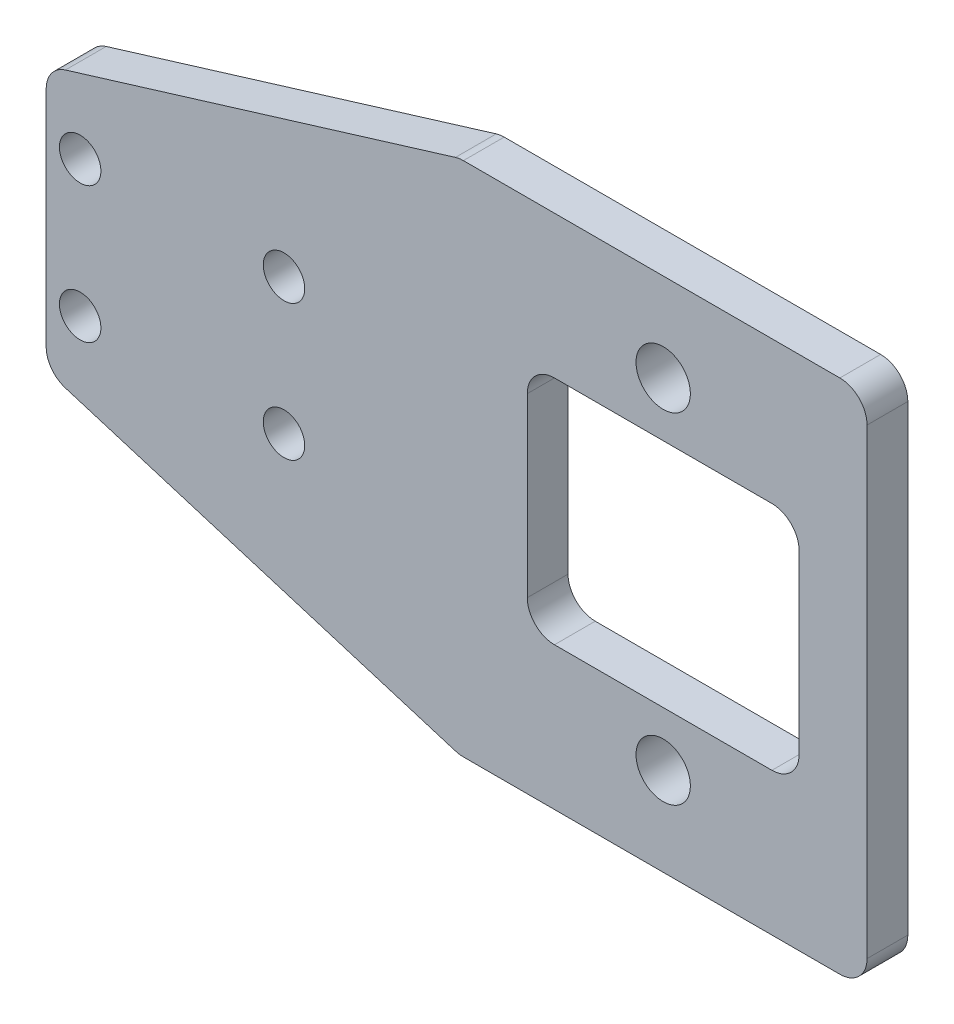
ISO-10303-21;
HEADER;
FILE_DESCRIPTION(('STEP AP214'),'2;1');
FILE_NAME('part.step','',(''),(''),'','','');
FILE_SCHEMA(('AUTOMOTIVE_DESIGN { 1 0 10303 214 1 1 1 1 }'));
ENDSEC;
DATA;
#1=APPLICATION_CONTEXT('core data for automotive mechanical design processes');
#2=APPLICATION_PROTOCOL_DEFINITION('international standard','automotive_design',2000,#1);
#3=PRODUCT_CONTEXT('',#1,'mechanical');
#4=PRODUCT('Part','Part','',(#3));
#5=PRODUCT_RELATED_PRODUCT_CATEGORY('part','',(#4));
#6=PRODUCT_DEFINITION_FORMATION('','',#4);
#7=PRODUCT_DEFINITION_CONTEXT('part definition',#1,'design');
#8=PRODUCT_DEFINITION('design','',#6,#7);
#9=PRODUCT_DEFINITION_SHAPE('','',#8);
#10=(LENGTH_UNIT() NAMED_UNIT(*) SI_UNIT(.MILLI.,.METRE.));
#11=(NAMED_UNIT(*) PLANE_ANGLE_UNIT() SI_UNIT($,.RADIAN.));
#12=(NAMED_UNIT(*) SI_UNIT($,.STERADIAN.) SOLID_ANGLE_UNIT());
#13=UNCERTAINTY_MEASURE_WITH_UNIT(LENGTH_MEASURE(1.E-05),#10,'distance_accuracy_value','');
#14=(GEOMETRIC_REPRESENTATION_CONTEXT(3) GLOBAL_UNCERTAINTY_ASSIGNED_CONTEXT((#13)) GLOBAL_UNIT_ASSIGNED_CONTEXT((#10,
#11,#12)) REPRESENTATION_CONTEXT('',''));
#15=CARTESIAN_POINT('',(0.,0.,0.));
#16=DIRECTION('',(0.,0.,1.));
#17=DIRECTION('',(1.,0.,0.));
#18=AXIS2_PLACEMENT_3D('',#15,#16,#17);
#19=CARTESIAN_POINT('',(-45.4,0.,3.));
#20=DIRECTION('',(1.,0.,0.));
#21=DIRECTION('',(0.,0.,-1.));
#22=AXIS2_PLACEMENT_3D('',#19,#20,#21);
#23=PLANE('',#22);
#24=DIRECTION('',(0.,-1.,0.));
#25=VECTOR('',#24,1.);
#26=CARTESIAN_POINT('',(-45.4,0.,3.));
#27=LINE('',#26,#25);
#28=CARTESIAN_POINT('',(-45.4,8.2203472423068,3.));
#29=VERTEX_POINT('',#28);
#30=CARTESIAN_POINT('',(-45.4,-8.2203472423068,3.));
#31=VERTEX_POINT('',#30);
#32=EDGE_CURVE('E194',#29,#31,#27,.T.);
#33=ORIENTED_EDGE('',*,*,#32,.F.);
#34=DIRECTION('',(0.,0.,-1.));
#35=VECTOR('',#34,1.);
#36=CARTESIAN_POINT('',(-45.4,8.2203472423068,3.));
#37=LINE('',#36,#35);
#38=CARTESIAN_POINT('',(-45.4,8.2203472423068,0.));
#39=VERTEX_POINT('',#38);
#40=EDGE_CURVE('E179',#29,#39,#37,.T.);
#41=ORIENTED_EDGE('',*,*,#40,.T.);
#42=DIRECTION('',(0.,-1.,0.));
#43=VECTOR('',#42,1.);
#44=CARTESIAN_POINT('',(-45.4,0.,0.));
#45=LINE('',#44,#43);
#46=CARTESIAN_POINT('',(-45.4,-8.2203472423068,0.));
#47=VERTEX_POINT('',#46);
#48=EDGE_CURVE('E191',#39,#47,#45,.T.);
#49=ORIENTED_EDGE('',*,*,#48,.T.);
#50=DIRECTION('',(0.,0.,-1.));
#51=VECTOR('',#50,1.);
#52=CARTESIAN_POINT('',(-45.4,-8.2203472423068,3.));
#53=LINE('',#52,#51);
#54=EDGE_CURVE('E196',#47,#31,#53,.F.);
#55=ORIENTED_EDGE('',*,*,#54,.T.);
#56=EDGE_LOOP('',(#33,#41,#49,#55));
#57=FACE_BOUND('',#56,.T.);
#58=ADVANCED_FACE('F37',(#57),#23,.F.);
#59=CARTESIAN_POINT('',(-6.59875327759363,-21.5701182407362,3.));
#60=DIRECTION('',(0.292538182187218,0.956253842848539,0.));
#61=DIRECTION('',(-0.956253842848539,0.292538182187218,0.));
#62=AXIS2_PLACEMENT_3D('',#59,#60,#61);
#63=PLANE('',#62);
#64=DIRECTION('',(0.956253842848539,-0.292538182187218,0.));
#65=VECTOR('',#64,1.);
#66=CARTESIAN_POINT('',(-6.59875327759363,-21.5701182407362,3.));
#67=LINE('',#66,#65);
#68=CARTESIAN_POINT('',(-43.9850763643744,-10.1328549280039,3.));
#69=VERTEX_POINT('',#68);
#70=CARTESIAN_POINT('',(-15.2859963822375,-18.9125076856971,3.));
#71=VERTEX_POINT('',#70);
#72=EDGE_CURVE('E367',#69,#71,#67,.T.);
#73=ORIENTED_EDGE('',*,*,#72,.F.);
#74=DIRECTION('',(0.,0.,-1.));
#75=VECTOR('',#74,1.);
#76=CARTESIAN_POINT('',(-43.9850763643744,-10.1328549280039,3.));
#77=LINE('',#76,#75);
#78=CARTESIAN_POINT('',(-43.9850763643744,-10.1328549280039,0.));
#79=VERTEX_POINT('',#78);
#80=EDGE_CURVE('E254',#69,#79,#77,.T.);
#81=ORIENTED_EDGE('',*,*,#80,.T.);
#82=DIRECTION('',(0.956253842848539,-0.292538182187218,0.));
#83=VECTOR('',#82,1.);
#84=CARTESIAN_POINT('',(-6.59875327759363,-21.5701182407362,0.));
#85=LINE('',#84,#83);
#86=CARTESIAN_POINT('',(-15.2859963822375,-18.9125076856971,0.));
#87=VERTEX_POINT('',#86);
#88=EDGE_CURVE('E201',#79,#87,#85,.T.);
#89=ORIENTED_EDGE('',*,*,#88,.T.);
#90=DIRECTION('',(0.,0.,-1.));
#91=VECTOR('',#90,1.);
#92=CARTESIAN_POINT('',(-15.2859963822375,-18.9125076856971,3.));
#93=LINE('',#92,#91);
#94=EDGE_CURVE('E252',#87,#71,#93,.F.);
#95=ORIENTED_EDGE('',*,*,#94,.T.);
#96=EDGE_LOOP('',(#73,#81,#89,#95));
#97=FACE_BOUND('',#96,.T.);
#98=ADVANCED_FACE('F416',(#97),#63,.F.);
#99=CARTESIAN_POINT('',(0.,-19.,3.));
#100=DIRECTION('',(0.,1.,0.));
#101=DIRECTION('',(0.,0.,1.));
#102=AXIS2_PLACEMENT_3D('',#99,#100,#101);
#103=PLANE('',#102);
#104=DIRECTION('',(1.,0.,0.));
#105=VECTOR('',#104,1.);
#106=CARTESIAN_POINT('',(0.,-19.,3.));
#107=LINE('',#106,#105);
#108=CARTESIAN_POINT('',(-14.7009200178631,-19.,3.));
#109=VERTEX_POINT('',#108);
#110=CARTESIAN_POINT('',(13.,-19.,3.));
#111=VERTEX_POINT('',#110);
#112=EDGE_CURVE('E370',#109,#111,#107,.T.);
#113=ORIENTED_EDGE('',*,*,#112,.F.);
#114=DIRECTION('',(0.,0.,-1.));
#115=VECTOR('',#114,1.);
#116=CARTESIAN_POINT('',(-14.7009200178631,-19.,3.));
#117=LINE('',#116,#115);
#118=CARTESIAN_POINT('',(-14.7009200178631,-19.,0.));
#119=VERTEX_POINT('',#118);
#120=EDGE_CURVE('E259',#109,#119,#117,.T.);
#121=ORIENTED_EDGE('',*,*,#120,.T.);
#122=DIRECTION('',(1.,0.,0.));
#123=VECTOR('',#122,1.);
#124=CARTESIAN_POINT('',(0.,-19.,0.));
#125=LINE('',#124,#123);
#126=CARTESIAN_POINT('',(13.,-19.,0.));
#127=VERTEX_POINT('',#126);
#128=EDGE_CURVE('E205',#119,#127,#125,.T.);
#129=ORIENTED_EDGE('',*,*,#128,.T.);
#130=DIRECTION('',(0.,0.,-1.));
#131=VECTOR('',#130,1.);
#132=CARTESIAN_POINT('',(13.,-19.,3.));
#133=LINE('',#132,#131);
#134=EDGE_CURVE('E257',#127,#111,#133,.F.);
#135=ORIENTED_EDGE('',*,*,#134,.T.);
#136=EDGE_LOOP('',(#113,#121,#129,#135));
#137=FACE_BOUND('',#136,.T.);
#138=ADVANCED_FACE('F408',(#137),#103,.F.);
#139=CARTESIAN_POINT('',(15.,0.,3.));
#140=DIRECTION('',(-1.,0.,0.));
#141=DIRECTION('',(0.,0.,1.));
#142=AXIS2_PLACEMENT_3D('',#139,#140,#141);
#143=PLANE('',#142);
#144=DIRECTION('',(0.,1.,0.));
#145=VECTOR('',#144,1.);
#146=CARTESIAN_POINT('',(15.,0.,3.));
#147=LINE('',#146,#145);
#148=CARTESIAN_POINT('',(15.,-17.,3.));
#149=VERTEX_POINT('',#148);
#150=CARTESIAN_POINT('',(15.,17.,3.));
#151=VERTEX_POINT('',#150);
#152=EDGE_CURVE('E373',#149,#151,#147,.T.);
#153=ORIENTED_EDGE('',*,*,#152,.F.);
#154=DIRECTION('',(0.,0.,-1.));
#155=VECTOR('',#154,1.);
#156=CARTESIAN_POINT('',(15.,-17.,3.));
#157=LINE('',#156,#155);
#158=CARTESIAN_POINT('',(15.,-17.,0.));
#159=VERTEX_POINT('',#158);
#160=EDGE_CURVE('E264',#149,#159,#157,.T.);
#161=ORIENTED_EDGE('',*,*,#160,.T.);
#162=DIRECTION('',(0.,1.,0.));
#163=VECTOR('',#162,1.);
#164=CARTESIAN_POINT('',(15.,0.,0.));
#165=LINE('',#164,#163);
#166=CARTESIAN_POINT('',(15.,17.,0.));
#167=VERTEX_POINT('',#166);
#168=EDGE_CURVE('E216',#159,#167,#165,.T.);
#169=ORIENTED_EDGE('',*,*,#168,.T.);
#170=DIRECTION('',(0.,0.,-1.));
#171=VECTOR('',#170,1.);
#172=CARTESIAN_POINT('',(15.,17.,3.));
#173=LINE('',#172,#171);
#174=EDGE_CURVE('E262',#167,#151,#173,.F.);
#175=ORIENTED_EDGE('',*,*,#174,.T.);
#176=EDGE_LOOP('',(#153,#161,#169,#175));
#177=FACE_BOUND('',#176,.T.);
#178=ADVANCED_FACE('F399',(#177),#143,.F.);
#179=CARTESIAN_POINT('',(0.,19.,3.));
#180=DIRECTION('',(0.,1.,0.));
#181=DIRECTION('',(0.,0.,1.));
#182=AXIS2_PLACEMENT_3D('',#179,#180,#181);
#183=PLANE('',#182);
#184=DIRECTION('',(1.,0.,0.));
#185=VECTOR('',#184,1.);
#186=CARTESIAN_POINT('',(0.,19.,0.));
#187=LINE('',#186,#185);
#188=CARTESIAN_POINT('',(-14.7009200178631,19.,0.));
#189=VERTEX_POINT('',#188);
#190=CARTESIAN_POINT('',(13.,19.,0.));
#191=VERTEX_POINT('',#190);
#192=EDGE_CURVE('E219',#189,#191,#187,.T.);
#193=ORIENTED_EDGE('',*,*,#192,.F.);
#194=DIRECTION('',(0.,0.,-1.));
#195=VECTOR('',#194,1.);
#196=CARTESIAN_POINT('',(-14.7009200178631,19.,3.));
#197=LINE('',#196,#195);
#198=CARTESIAN_POINT('',(-14.7009200178631,19.,3.));
#199=VERTEX_POINT('',#198);
#200=EDGE_CURVE('E250',#189,#199,#197,.F.);
#201=ORIENTED_EDGE('',*,*,#200,.T.);
#202=DIRECTION('',(1.,0.,0.));
#203=VECTOR('',#202,1.);
#204=CARTESIAN_POINT('',(0.,19.,3.));
#205=LINE('',#204,#203);
#206=CARTESIAN_POINT('',(13.,19.,3.));
#207=VERTEX_POINT('',#206);
#208=EDGE_CURVE('E375',#199,#207,#205,.T.);
#209=ORIENTED_EDGE('',*,*,#208,.T.);
#210=DIRECTION('',(0.,0.,-1.));
#211=VECTOR('',#210,1.);
#212=CARTESIAN_POINT('',(13.,19.,0.));
#213=LINE('',#212,#211);
#214=EDGE_CURVE('E247',#207,#191,#213,.T.);
#215=ORIENTED_EDGE('',*,*,#214,.T.);
#216=EDGE_LOOP('',(#193,#201,#209,#215));
#217=FACE_BOUND('',#216,.T.);
#218=ADVANCED_FACE('F391',(#217),#183,.T.);
#219=CARTESIAN_POINT('',(-6.59875327759363,21.5701182407362,3.));
#220=DIRECTION('',(0.292538182187218,-0.956253842848539,0.));
#221=DIRECTION('',(0.956253842848539,0.292538182187218,0.));
#222=AXIS2_PLACEMENT_3D('',#219,#220,#221);
#223=PLANE('',#222);
#224=DIRECTION('',(-0.956253842848539,-0.292538182187218,0.));
#225=VECTOR('',#224,1.);
#226=CARTESIAN_POINT('',(-6.59875327759363,21.5701182407362,0.));
#227=LINE('',#226,#225);
#228=CARTESIAN_POINT('',(-15.2859963822375,18.9125076856971,0.));
#229=VERTEX_POINT('',#228);
#230=CARTESIAN_POINT('',(-43.9850763643744,10.1328549280039,0.));
#231=VERTEX_POINT('',#230);
#232=EDGE_CURVE('E222',#229,#231,#227,.T.);
#233=ORIENTED_EDGE('',*,*,#232,.T.);
#234=DIRECTION('',(0.,0.,-1.));
#235=VECTOR('',#234,1.);
#236=CARTESIAN_POINT('',(-43.9850763643744,10.1328549280039,3.));
#237=LINE('',#236,#235);
#238=CARTESIAN_POINT('',(-43.9850763643744,10.1328549280039,3.));
#239=VERTEX_POINT('',#238);
#240=EDGE_CURVE('E180',#231,#239,#237,.F.);
#241=ORIENTED_EDGE('',*,*,#240,.T.);
#242=DIRECTION('',(-0.956253842848539,-0.292538182187218,0.));
#243=VECTOR('',#242,1.);
#244=CARTESIAN_POINT('',(-6.59875327759363,21.5701182407362,3.));
#245=LINE('',#244,#243);
#246=CARTESIAN_POINT('',(-15.2859963822375,18.9125076856971,3.));
#247=VERTEX_POINT('',#246);
#248=EDGE_CURVE('E211',#247,#239,#245,.T.);
#249=ORIENTED_EDGE('',*,*,#248,.F.);
#250=DIRECTION('',(0.,0.,-1.));
#251=VECTOR('',#250,1.);
#252=CARTESIAN_POINT('',(-15.2859963822375,18.9125076856971,0.));
#253=LINE('',#252,#251);
#254=EDGE_CURVE('E185',#247,#229,#253,.T.);
#255=ORIENTED_EDGE('',*,*,#254,.T.);
#256=EDGE_LOOP('',(#233,#241,#249,#255));
#257=FACE_BOUND('',#256,.T.);
#258=ADVANCED_FACE('F386',(#257),#223,.F.);
#259=CARTESIAN_POINT('',(0.,0.,3.));
#260=DIRECTION('',(0.,0.,1.));
#261=DIRECTION('',(1.,0.,0.));
#262=AXIS2_PLACEMENT_3D('',#259,#260,#261);
#263=PLANE('',#262);
#264=DIRECTION('',(0.,1.,0.));
#265=VECTOR('',#264,1.);
#266=CARTESIAN_POINT('',(10.,-8.50000000000001,3.));
#267=LINE('',#266,#265);
#268=CARTESIAN_POINT('',(10.,-6.50000000000001,3.));
#269=VERTEX_POINT('',#268);
#270=CARTESIAN_POINT('',(10.,6.50000000000001,3.));
#271=VERTEX_POINT('',#270);
#272=EDGE_CURVE('E303',#269,#271,#267,.T.);
#273=ORIENTED_EDGE('',*,*,#272,.F.);
#274=CARTESIAN_POINT('',(8.,-6.50000000000001,3.));
#275=DIRECTION('',(0.,0.,1.));
#276=DIRECTION('',(1.,0.,0.));
#277=AXIS2_PLACEMENT_3D('',#274,#275,#276);
#278=CIRCLE('',#277,2.);
#279=CARTESIAN_POINT('',(8.,-8.50000000000001,3.));
#280=VERTEX_POINT('',#279);
#281=EDGE_CURVE('E45',#269,#280,#278,.F.);
#282=ORIENTED_EDGE('',*,*,#281,.T.);
#283=DIRECTION('',(1.,0.,0.));
#284=VECTOR('',#283,1.);
#285=CARTESIAN_POINT('',(-9.99999999999999,-8.50000000000001,3.));
#286=LINE('',#285,#284);
#287=CARTESIAN_POINT('',(-7.99999999999999,-8.50000000000001,3.));
#288=VERTEX_POINT('',#287);
#289=EDGE_CURVE('E301',#288,#280,#286,.T.);
#290=ORIENTED_EDGE('',*,*,#289,.F.);
#291=CARTESIAN_POINT('',(-7.99999999999999,-6.50000000000001,3.));
#292=DIRECTION('',(0.,0.,1.));
#293=DIRECTION('',(1.,0.,0.));
#294=AXIS2_PLACEMENT_3D('',#291,#292,#293);
#295=CIRCLE('',#294,2.);
#296=CARTESIAN_POINT('',(-9.99999999999999,-6.50000000000001,3.));
#297=VERTEX_POINT('',#296);
#298=EDGE_CURVE('E294',#288,#297,#295,.F.);
#299=ORIENTED_EDGE('',*,*,#298,.T.);
#300=DIRECTION('',(0.,-1.,0.));
#301=VECTOR('',#300,1.);
#302=CARTESIAN_POINT('',(-9.99999999999999,-8.50000000000001,3.));
#303=LINE('',#302,#301);
#304=CARTESIAN_POINT('',(-10.,6.50000000000001,3.));
#305=VERTEX_POINT('',#304);
#306=EDGE_CURVE('E309',#305,#297,#303,.T.);
#307=ORIENTED_EDGE('',*,*,#306,.F.);
#308=CARTESIAN_POINT('',(-8.,6.50000000000001,3.));
#309=DIRECTION('',(0.,0.,1.));
#310=DIRECTION('',(1.,0.,0.));
#311=AXIS2_PLACEMENT_3D('',#308,#309,#310);
#312=CIRCLE('',#311,2.);
#313=CARTESIAN_POINT('',(-8.,8.50000000000001,3.));
#314=VERTEX_POINT('',#313);
#315=EDGE_CURVE('E286',#305,#314,#312,.F.);
#316=ORIENTED_EDGE('',*,*,#315,.T.);
#317=DIRECTION('',(-1.,0.,0.));
#318=VECTOR('',#317,1.);
#319=CARTESIAN_POINT('',(-10.,8.50000000000001,3.));
#320=LINE('',#319,#318);
#321=CARTESIAN_POINT('',(8.,8.50000000000001,3.));
#322=VERTEX_POINT('',#321);
#323=EDGE_CURVE('E330',#322,#314,#320,.T.);
#324=ORIENTED_EDGE('',*,*,#323,.F.);
#325=CARTESIAN_POINT('',(8.,6.50000000000001,3.));
#326=DIRECTION('',(0.,0.,1.));
#327=DIRECTION('',(1.,0.,0.));
#328=AXIS2_PLACEMENT_3D('',#325,#326,#327);
#329=CIRCLE('',#328,2.);
#330=EDGE_CURVE('E290',#322,#271,#329,.F.);
#331=ORIENTED_EDGE('',*,*,#330,.T.);
#332=EDGE_LOOP('',(#273,#282,#290,#299,#307,#316,#324,#331));
#333=FACE_BOUND('',#332,.T.);
#334=CARTESIAN_POINT('',(-27.9,5.,3.));
#335=DIRECTION('',(0.,0.,1.));
#336=DIRECTION('',(1.,0.,0.));
#337=AXIS2_PLACEMENT_3D('',#334,#335,#336);
#338=CIRCLE('',#337,1.525);
#339=CARTESIAN_POINT('',(-26.375,5.,3.));
#340=VERTEX_POINT('',#339);
#341=EDGE_CURVE('E345',#340,#340,#338,.T.);
#342=ORIENTED_EDGE('',*,*,#341,.F.);
#343=EDGE_LOOP('',(#342));
#344=FACE_BOUND('',#343,.T.);
#345=CARTESIAN_POINT('',(-42.9,-5.,3.));
#346=DIRECTION('',(0.,0.,1.));
#347=DIRECTION('',(1.,0.,0.));
#348=AXIS2_PLACEMENT_3D('',#345,#346,#347);
#349=CIRCLE('',#348,1.525);
#350=CARTESIAN_POINT('',(-41.375,-5.,3.));
#351=VERTEX_POINT('',#350);
#352=EDGE_CURVE('E338',#351,#351,#349,.T.);
#353=ORIENTED_EDGE('',*,*,#352,.F.);
#354=EDGE_LOOP('',(#353));
#355=FACE_BOUND('',#354,.T.);
#356=CARTESIAN_POINT('',(-27.9,-5.,3.));
#357=DIRECTION('',(0.,0.,1.));
#358=DIRECTION('',(1.,0.,0.));
#359=AXIS2_PLACEMENT_3D('',#356,#357,#358);
#360=CIRCLE('',#359,1.525);
#361=CARTESIAN_POINT('',(-26.375,-5.,3.));
#362=VERTEX_POINT('',#361);
#363=EDGE_CURVE('E328',#362,#362,#360,.T.);
#364=ORIENTED_EDGE('',*,*,#363,.F.);
#365=EDGE_LOOP('',(#364));
#366=FACE_BOUND('',#365,.T.);
#367=CARTESIAN_POINT('',(-42.9,5.,3.));
#368=DIRECTION('',(0.,0.,1.));
#369=DIRECTION('',(1.,0.,0.));
#370=AXIS2_PLACEMENT_3D('',#367,#368,#369);
#371=CIRCLE('',#370,1.525);
#372=CARTESIAN_POINT('',(-41.375,5.,3.));
#373=VERTEX_POINT('',#372);
#374=EDGE_CURVE('E344',#373,#373,#371,.T.);
#375=ORIENTED_EDGE('',*,*,#374,.F.);
#376=EDGE_LOOP('',(#375));
#377=FACE_BOUND('',#376,.T.);
#378=CARTESIAN_POINT('',(0.,12.5,3.));
#379=DIRECTION('',(0.,0.,1.));
#380=DIRECTION('',(1.,0.,0.));
#381=AXIS2_PLACEMENT_3D('',#378,#379,#380);
#382=CIRCLE('',#381,2.);
#383=CARTESIAN_POINT('',(1.99999999999999,12.5,3.));
#384=VERTEX_POINT('',#383);
#385=EDGE_CURVE('E208',#384,#384,#382,.T.);
#386=ORIENTED_EDGE('',*,*,#385,.F.);
#387=EDGE_LOOP('',(#386));
#388=FACE_BOUND('',#387,.T.);
#389=CARTESIAN_POINT('',(0.,-12.5,3.));
#390=DIRECTION('',(0.,0.,1.));
#391=DIRECTION('',(1.,0.,0.));
#392=AXIS2_PLACEMENT_3D('',#389,#390,#391);
#393=CIRCLE('',#392,2.);
#394=CARTESIAN_POINT('',(1.99999999999999,-12.5,3.));
#395=VERTEX_POINT('',#394);
#396=EDGE_CURVE('E356',#395,#395,#393,.T.);
#397=ORIENTED_EDGE('',*,*,#396,.F.);
#398=EDGE_LOOP('',(#397));
#399=FACE_BOUND('',#398,.T.);
#400=ORIENTED_EDGE('',*,*,#248,.T.);
#401=CARTESIAN_POINT('',(-43.4,8.2203472423068,3.));
#402=DIRECTION('',(0.,0.,1.));
#403=DIRECTION('',(1.,0.,0.));
#404=AXIS2_PLACEMENT_3D('',#401,#402,#403);
#405=CIRCLE('',#404,2.);
#406=EDGE_CURVE('E245',#239,#29,#405,.T.);
#407=ORIENTED_EDGE('',*,*,#406,.T.);
#408=ORIENTED_EDGE('',*,*,#32,.T.);
#409=CARTESIAN_POINT('',(-43.4,-8.2203472423068,3.));
#410=DIRECTION('',(0.,0.,1.));
#411=DIRECTION('',(1.,0.,0.));
#412=AXIS2_PLACEMENT_3D('',#409,#410,#411);
#413=CIRCLE('',#412,2.);
#414=EDGE_CURVE('E241',#31,#69,#413,.T.);
#415=ORIENTED_EDGE('',*,*,#414,.T.);
#416=ORIENTED_EDGE('',*,*,#72,.T.);
#417=CARTESIAN_POINT('',(-14.7009200178631,-17.,3.));
#418=DIRECTION('',(0.,0.,1.));
#419=DIRECTION('',(1.,0.,0.));
#420=AXIS2_PLACEMENT_3D('',#417,#418,#419);
#421=CIRCLE('',#420,2.);
#422=EDGE_CURVE('E239',#71,#109,#421,.T.);
#423=ORIENTED_EDGE('',*,*,#422,.T.);
#424=ORIENTED_EDGE('',*,*,#112,.T.);
#425=CARTESIAN_POINT('',(13.,-17.,3.));
#426=DIRECTION('',(0.,0.,1.));
#427=DIRECTION('',(1.,0.,0.));
#428=AXIS2_PLACEMENT_3D('',#425,#426,#427);
#429=CIRCLE('',#428,2.);
#430=EDGE_CURVE('E237',#111,#149,#429,.T.);
#431=ORIENTED_EDGE('',*,*,#430,.T.);
#432=ORIENTED_EDGE('',*,*,#152,.T.);
#433=CARTESIAN_POINT('',(13.,17.,3.));
#434=DIRECTION('',(0.,0.,1.));
#435=DIRECTION('',(1.,0.,0.));
#436=AXIS2_PLACEMENT_3D('',#433,#434,#435);
#437=CIRCLE('',#436,2.);
#438=EDGE_CURVE('E235',#151,#207,#437,.T.);
#439=ORIENTED_EDGE('',*,*,#438,.T.);
#440=ORIENTED_EDGE('',*,*,#208,.F.);
#441=CARTESIAN_POINT('',(-14.7009200178631,17.,3.));
#442=DIRECTION('',(0.,0.,1.));
#443=DIRECTION('',(1.,0.,0.));
#444=AXIS2_PLACEMENT_3D('',#441,#442,#443);
#445=CIRCLE('',#444,2.);
#446=EDGE_CURVE('E243',#199,#247,#445,.T.);
#447=ORIENTED_EDGE('',*,*,#446,.T.);
#448=EDGE_LOOP('',(#400,#407,#408,#415,#416,#423,#424,#431,#432,#439,#440,#447));
#449=FACE_BOUND('',#448,.T.);
#450=ADVANCED_FACE('F299',(#333,#344,#355,#366,#377,#388,#399,#449),#263,.T.);
#451=CARTESIAN_POINT('',(0.,0.,0.));
#452=DIRECTION('',(0.,0.,1.));
#453=DIRECTION('',(1.,0.,0.));
#454=AXIS2_PLACEMENT_3D('',#451,#452,#453);
#455=PLANE('',#454);
#456=DIRECTION('',(0.,-1.,0.));
#457=VECTOR('',#456,1.);
#458=CARTESIAN_POINT('',(-9.99999999999999,-8.50000000000001,0.));
#459=LINE('',#458,#457);
#460=CARTESIAN_POINT('',(-10.,6.50000000000001,0.));
#461=VERTEX_POINT('',#460);
#462=CARTESIAN_POINT('',(-9.99999999999999,-6.50000000000001,0.));
#463=VERTEX_POINT('',#462);
#464=EDGE_CURVE('E323',#461,#463,#459,.T.);
#465=ORIENTED_EDGE('',*,*,#464,.T.);
#466=CARTESIAN_POINT('',(-7.99999999999999,-6.50000000000001,0.));
#467=DIRECTION('',(0.,0.,1.));
#468=DIRECTION('',(1.,0.,0.));
#469=AXIS2_PLACEMENT_3D('',#466,#467,#468);
#470=CIRCLE('',#469,2.);
#471=CARTESIAN_POINT('',(-7.99999999999999,-8.50000000000001,0.));
#472=VERTEX_POINT('',#471);
#473=EDGE_CURVE('E59',#463,#472,#470,.T.);
#474=ORIENTED_EDGE('',*,*,#473,.T.);
#475=DIRECTION('',(1.,0.,0.));
#476=VECTOR('',#475,1.);
#477=CARTESIAN_POINT('',(-9.99999999999999,-8.50000000000001,0.));
#478=LINE('',#477,#476);
#479=CARTESIAN_POINT('',(8.,-8.50000000000001,0.));
#480=VERTEX_POINT('',#479);
#481=EDGE_CURVE('E316',#472,#480,#478,.T.);
#482=ORIENTED_EDGE('',*,*,#481,.T.);
#483=CARTESIAN_POINT('',(8.,-6.50000000000001,0.));
#484=DIRECTION('',(0.,0.,1.));
#485=DIRECTION('',(1.,0.,0.));
#486=AXIS2_PLACEMENT_3D('',#483,#484,#485);
#487=CIRCLE('',#486,2.);
#488=CARTESIAN_POINT('',(10.,-6.50000000000001,0.));
#489=VERTEX_POINT('',#488);
#490=EDGE_CURVE('E11',#480,#489,#487,.T.);
#491=ORIENTED_EDGE('',*,*,#490,.T.);
#492=DIRECTION('',(0.,1.,0.));
#493=VECTOR('',#492,1.);
#494=CARTESIAN_POINT('',(10.,-8.50000000000001,0.));
#495=LINE('',#494,#493);
#496=CARTESIAN_POINT('',(10.,6.50000000000001,0.));
#497=VERTEX_POINT('',#496);
#498=EDGE_CURVE('E308',#489,#497,#495,.T.);
#499=ORIENTED_EDGE('',*,*,#498,.T.);
#500=CARTESIAN_POINT('',(8.,6.50000000000001,0.));
#501=DIRECTION('',(0.,0.,1.));
#502=DIRECTION('',(1.,0.,0.));
#503=AXIS2_PLACEMENT_3D('',#500,#501,#502);
#504=CIRCLE('',#503,2.);
#505=CARTESIAN_POINT('',(8.,8.50000000000001,0.));
#506=VERTEX_POINT('',#505);
#507=EDGE_CURVE('E292',#497,#506,#504,.T.);
#508=ORIENTED_EDGE('',*,*,#507,.T.);
#509=DIRECTION('',(-1.,0.,0.));
#510=VECTOR('',#509,1.);
#511=CARTESIAN_POINT('',(-10.,8.50000000000001,0.));
#512=LINE('',#511,#510);
#513=CARTESIAN_POINT('',(-8.,8.50000000000001,0.));
#514=VERTEX_POINT('',#513);
#515=EDGE_CURVE('E320',#506,#514,#512,.T.);
#516=ORIENTED_EDGE('',*,*,#515,.T.);
#517=CARTESIAN_POINT('',(-8.,6.50000000000001,0.));
#518=DIRECTION('',(0.,0.,1.));
#519=DIRECTION('',(1.,0.,0.));
#520=AXIS2_PLACEMENT_3D('',#517,#518,#519);
#521=CIRCLE('',#520,2.);
#522=EDGE_CURVE('E288',#514,#461,#521,.T.);
#523=ORIENTED_EDGE('',*,*,#522,.T.);
#524=EDGE_LOOP('',(#465,#474,#482,#491,#499,#508,#516,#523));
#525=FACE_BOUND('',#524,.T.);
#526=CARTESIAN_POINT('',(-27.9,5.,0.));
#527=DIRECTION('',(0.,0.,1.));
#528=DIRECTION('',(1.,0.,0.));
#529=AXIS2_PLACEMENT_3D('',#526,#527,#528);
#530=CIRCLE('',#529,1.525);
#531=CARTESIAN_POINT('',(-26.375,5.,0.));
#532=VERTEX_POINT('',#531);
#533=EDGE_CURVE('E341',#532,#532,#530,.T.);
#534=ORIENTED_EDGE('',*,*,#533,.T.);
#535=EDGE_LOOP('',(#534));
#536=FACE_BOUND('',#535,.T.);
#537=CARTESIAN_POINT('',(-42.9,-5.,0.));
#538=DIRECTION('',(0.,0.,1.));
#539=DIRECTION('',(1.,0.,0.));
#540=AXIS2_PLACEMENT_3D('',#537,#538,#539);
#541=CIRCLE('',#540,1.525);
#542=CARTESIAN_POINT('',(-41.375,-5.,0.));
#543=VERTEX_POINT('',#542);
#544=EDGE_CURVE('E348',#543,#543,#541,.T.);
#545=ORIENTED_EDGE('',*,*,#544,.T.);
#546=EDGE_LOOP('',(#545));
#547=FACE_BOUND('',#546,.T.);
#548=CARTESIAN_POINT('',(-27.9,-5.,0.));
#549=DIRECTION('',(0.,0.,1.));
#550=DIRECTION('',(1.,0.,0.));
#551=AXIS2_PLACEMENT_3D('',#548,#549,#550);
#552=CIRCLE('',#551,1.525);
#553=CARTESIAN_POINT('',(-26.375,-5.,0.));
#554=VERTEX_POINT('',#553);
#555=EDGE_CURVE('E335',#554,#554,#552,.T.);
#556=ORIENTED_EDGE('',*,*,#555,.T.);
#557=EDGE_LOOP('',(#556));
#558=FACE_BOUND('',#557,.T.);
#559=CARTESIAN_POINT('',(-42.9,5.,0.));
#560=DIRECTION('',(0.,0.,1.));
#561=DIRECTION('',(1.,0.,0.));
#562=AXIS2_PLACEMENT_3D('',#559,#560,#561);
#563=CIRCLE('',#562,1.525);
#564=CARTESIAN_POINT('',(-41.375,5.,0.));
#565=VERTEX_POINT('',#564);
#566=EDGE_CURVE('E353',#565,#565,#563,.T.);
#567=ORIENTED_EDGE('',*,*,#566,.T.);
#568=EDGE_LOOP('',(#567));
#569=FACE_BOUND('',#568,.T.);
#570=CARTESIAN_POINT('',(0.,12.5,0.));
#571=DIRECTION('',(0.,0.,1.));
#572=DIRECTION('',(1.,0.,0.));
#573=AXIS2_PLACEMENT_3D('',#570,#571,#572);
#574=CIRCLE('',#573,2.);
#575=CARTESIAN_POINT('',(1.99999999999999,12.5,0.));
#576=VERTEX_POINT('',#575);
#577=EDGE_CURVE('E202',#576,#576,#574,.T.);
#578=ORIENTED_EDGE('',*,*,#577,.T.);
#579=EDGE_LOOP('',(#578));
#580=FACE_BOUND('',#579,.T.);
#581=CARTESIAN_POINT('',(0.,-12.5,0.));
#582=DIRECTION('',(0.,0.,1.));
#583=DIRECTION('',(1.,0.,0.));
#584=AXIS2_PLACEMENT_3D('',#581,#582,#583);
#585=CIRCLE('',#584,2.);
#586=CARTESIAN_POINT('',(1.99999999999999,-12.5,0.));
#587=VERTEX_POINT('',#586);
#588=EDGE_CURVE('E361',#587,#587,#585,.T.);
#589=ORIENTED_EDGE('',*,*,#588,.T.);
#590=EDGE_LOOP('',(#589));
#591=FACE_BOUND('',#590,.T.);
#592=ORIENTED_EDGE('',*,*,#48,.F.);
#593=CARTESIAN_POINT('',(-43.4,8.2203472423068,0.));
#594=DIRECTION('',(0.,0.,1.));
#595=DIRECTION('',(1.,0.,0.));
#596=AXIS2_PLACEMENT_3D('',#593,#594,#595);
#597=CIRCLE('',#596,2.);
#598=EDGE_CURVE('E175',#39,#231,#597,.F.);
#599=ORIENTED_EDGE('',*,*,#598,.T.);
#600=ORIENTED_EDGE('',*,*,#232,.F.);
#601=CARTESIAN_POINT('',(-14.7009200178631,17.,0.));
#602=DIRECTION('',(0.,0.,1.));
#603=DIRECTION('',(1.,0.,0.));
#604=AXIS2_PLACEMENT_3D('',#601,#602,#603);
#605=CIRCLE('',#604,2.);
#606=EDGE_CURVE('E186',#229,#189,#605,.F.);
#607=ORIENTED_EDGE('',*,*,#606,.T.);
#608=ORIENTED_EDGE('',*,*,#192,.T.);
#609=CARTESIAN_POINT('',(13.,17.,0.));
#610=DIRECTION('',(0.,0.,1.));
#611=DIRECTION('',(1.,0.,0.));
#612=AXIS2_PLACEMENT_3D('',#609,#610,#611);
#613=CIRCLE('',#612,2.);
#614=EDGE_CURVE('E195',#191,#167,#613,.F.);
#615=ORIENTED_EDGE('',*,*,#614,.T.);
#616=ORIENTED_EDGE('',*,*,#168,.F.);
#617=CARTESIAN_POINT('',(13.,-17.,0.));
#618=DIRECTION('',(0.,0.,1.));
#619=DIRECTION('',(1.,0.,0.));
#620=AXIS2_PLACEMENT_3D('',#617,#618,#619);
#621=CIRCLE('',#620,2.);
#622=EDGE_CURVE('E226',#159,#127,#621,.F.);
#623=ORIENTED_EDGE('',*,*,#622,.T.);
#624=ORIENTED_EDGE('',*,*,#128,.F.);
#625=CARTESIAN_POINT('',(-14.7009200178631,-17.,0.));
#626=DIRECTION('',(0.,0.,1.));
#627=DIRECTION('',(1.,0.,0.));
#628=AXIS2_PLACEMENT_3D('',#625,#626,#627);
#629=CIRCLE('',#628,2.);
#630=EDGE_CURVE('E228',#119,#87,#629,.F.);
#631=ORIENTED_EDGE('',*,*,#630,.T.);
#632=ORIENTED_EDGE('',*,*,#88,.F.);
#633=CARTESIAN_POINT('',(-43.4,-8.2203472423068,0.));
#634=DIRECTION('',(0.,0.,1.));
#635=DIRECTION('',(1.,0.,0.));
#636=AXIS2_PLACEMENT_3D('',#633,#634,#635);
#637=CIRCLE('',#636,2.);
#638=EDGE_CURVE('E200',#79,#47,#637,.F.);
#639=ORIENTED_EDGE('',*,*,#638,.T.);
#640=EDGE_LOOP('',(#592,#599,#600,#607,#608,#615,#616,#623,#624,#631,#632,#639));
#641=FACE_BOUND('',#640,.T.);
#642=ADVANCED_FACE('F198',(#525,#536,#547,#558,#569,#580,#591,#641),#455,.F.);
#643=CARTESIAN_POINT('',(0.,-12.5,0.));
#644=DIRECTION('',(0.,0.,1.));
#645=DIRECTION('',(1.,0.,0.));
#646=AXIS2_PLACEMENT_3D('',#643,#644,#645);
#647=CYLINDRICAL_SURFACE('',#646,2.);
#648=ORIENTED_EDGE('',*,*,#588,.F.);
#649=EDGE_LOOP('',(#648));
#650=FACE_BOUND('',#649,.T.);
#651=ORIENTED_EDGE('',*,*,#396,.T.);
#652=EDGE_LOOP('',(#651));
#653=FACE_BOUND('',#652,.T.);
#654=ADVANCED_FACE('F463',(#650,#653),#647,.F.);
#655=CARTESIAN_POINT('',(0.,12.5,0.));
#656=DIRECTION('',(0.,0.,1.));
#657=DIRECTION('',(1.,0.,0.));
#658=AXIS2_PLACEMENT_3D('',#655,#656,#657);
#659=CYLINDRICAL_SURFACE('',#658,2.);
#660=ORIENTED_EDGE('',*,*,#577,.F.);
#661=EDGE_LOOP('',(#660));
#662=FACE_BOUND('',#661,.T.);
#663=ORIENTED_EDGE('',*,*,#385,.T.);
#664=EDGE_LOOP('',(#663));
#665=FACE_BOUND('',#664,.T.);
#666=ADVANCED_FACE('F459',(#662,#665),#659,.F.);
#667=CARTESIAN_POINT('',(-42.9,5.,0.));
#668=DIRECTION('',(0.,0.,1.));
#669=DIRECTION('',(1.,0.,0.));
#670=AXIS2_PLACEMENT_3D('',#667,#668,#669);
#671=CYLINDRICAL_SURFACE('',#670,1.525);
#672=ORIENTED_EDGE('',*,*,#566,.F.);
#673=EDGE_LOOP('',(#672));
#674=FACE_BOUND('',#673,.T.);
#675=ORIENTED_EDGE('',*,*,#374,.T.);
#676=EDGE_LOOP('',(#675));
#677=FACE_BOUND('',#676,.T.);
#678=ADVANCED_FACE('F456',(#674,#677),#671,.F.);
#679=CARTESIAN_POINT('',(-27.9,-5.,0.));
#680=DIRECTION('',(0.,0.,1.));
#681=DIRECTION('',(1.,0.,0.));
#682=AXIS2_PLACEMENT_3D('',#679,#680,#681);
#683=CYLINDRICAL_SURFACE('',#682,1.525);
#684=ORIENTED_EDGE('',*,*,#555,.F.);
#685=EDGE_LOOP('',(#684));
#686=FACE_BOUND('',#685,.T.);
#687=ORIENTED_EDGE('',*,*,#363,.T.);
#688=EDGE_LOOP('',(#687));
#689=FACE_BOUND('',#688,.T.);
#690=ADVANCED_FACE('F448',(#686,#689),#683,.F.);
#691=CARTESIAN_POINT('',(-42.9,-5.,0.));
#692=DIRECTION('',(0.,0.,1.));
#693=DIRECTION('',(1.,0.,0.));
#694=AXIS2_PLACEMENT_3D('',#691,#692,#693);
#695=CYLINDRICAL_SURFACE('',#694,1.525);
#696=ORIENTED_EDGE('',*,*,#544,.F.);
#697=EDGE_LOOP('',(#696));
#698=FACE_BOUND('',#697,.T.);
#699=ORIENTED_EDGE('',*,*,#352,.T.);
#700=EDGE_LOOP('',(#699));
#701=FACE_BOUND('',#700,.T.);
#702=ADVANCED_FACE('F442',(#698,#701),#695,.F.);
#703=CARTESIAN_POINT('',(-27.9,5.,0.));
#704=DIRECTION('',(0.,0.,1.));
#705=DIRECTION('',(1.,0.,0.));
#706=AXIS2_PLACEMENT_3D('',#703,#704,#705);
#707=CYLINDRICAL_SURFACE('',#706,1.525);
#708=ORIENTED_EDGE('',*,*,#533,.F.);
#709=EDGE_LOOP('',(#708));
#710=FACE_BOUND('',#709,.T.);
#711=ORIENTED_EDGE('',*,*,#341,.T.);
#712=EDGE_LOOP('',(#711));
#713=FACE_BOUND('',#712,.T.);
#714=ADVANCED_FACE('F438',(#710,#713),#707,.F.);
#715=CARTESIAN_POINT('',(-43.4,8.2203472423068,3.));
#716=DIRECTION('',(0.,0.,-1.));
#717=DIRECTION('',(-1.,0.,0.));
#718=AXIS2_PLACEMENT_3D('',#715,#716,#717);
#719=CYLINDRICAL_SURFACE('',#718,2.);
#720=ORIENTED_EDGE('',*,*,#406,.F.);
#721=ORIENTED_EDGE('',*,*,#240,.F.);
#722=ORIENTED_EDGE('',*,*,#598,.F.);
#723=ORIENTED_EDGE('',*,*,#40,.F.);
#724=EDGE_LOOP('',(#720,#721,#722,#723));
#725=FACE_BOUND('',#724,.T.);
#726=ADVANCED_FACE('F178',(#725),#719,.T.);
#727=CARTESIAN_POINT('',(-14.7009200178631,17.,3.));
#728=DIRECTION('',(0.,0.,1.));
#729=DIRECTION('',(1.,0.,0.));
#730=AXIS2_PLACEMENT_3D('',#727,#728,#729);
#731=CYLINDRICAL_SURFACE('',#730,2.);
#732=ORIENTED_EDGE('',*,*,#446,.F.);
#733=ORIENTED_EDGE('',*,*,#200,.F.);
#734=ORIENTED_EDGE('',*,*,#606,.F.);
#735=ORIENTED_EDGE('',*,*,#254,.F.);
#736=EDGE_LOOP('',(#732,#733,#734,#735));
#737=FACE_BOUND('',#736,.T.);
#738=ADVANCED_FACE('F388',(#737),#731,.T.);
#739=CARTESIAN_POINT('',(-43.4,-8.2203472423068,3.));
#740=DIRECTION('',(0.,0.,-1.));
#741=DIRECTION('',(-1.,0.,0.));
#742=AXIS2_PLACEMENT_3D('',#739,#740,#741);
#743=CYLINDRICAL_SURFACE('',#742,2.);
#744=ORIENTED_EDGE('',*,*,#414,.F.);
#745=ORIENTED_EDGE('',*,*,#54,.F.);
#746=ORIENTED_EDGE('',*,*,#638,.F.);
#747=ORIENTED_EDGE('',*,*,#80,.F.);
#748=EDGE_LOOP('',(#744,#745,#746,#747));
#749=FACE_BOUND('',#748,.T.);
#750=ADVANCED_FACE('F420',(#749),#743,.T.);
#751=CARTESIAN_POINT('',(-14.7009200178631,-17.,3.));
#752=DIRECTION('',(0.,0.,-1.));
#753=DIRECTION('',(-1.,0.,0.));
#754=AXIS2_PLACEMENT_3D('',#751,#752,#753);
#755=CYLINDRICAL_SURFACE('',#754,2.);
#756=ORIENTED_EDGE('',*,*,#422,.F.);
#757=ORIENTED_EDGE('',*,*,#94,.F.);
#758=ORIENTED_EDGE('',*,*,#630,.F.);
#759=ORIENTED_EDGE('',*,*,#120,.F.);
#760=EDGE_LOOP('',(#756,#757,#758,#759));
#761=FACE_BOUND('',#760,.T.);
#762=ADVANCED_FACE('F412',(#761),#755,.T.);
#763=CARTESIAN_POINT('',(13.,-17.,3.));
#764=DIRECTION('',(0.,0.,-1.));
#765=DIRECTION('',(-1.,0.,0.));
#766=AXIS2_PLACEMENT_3D('',#763,#764,#765);
#767=CYLINDRICAL_SURFACE('',#766,2.);
#768=ORIENTED_EDGE('',*,*,#430,.F.);
#769=ORIENTED_EDGE('',*,*,#134,.F.);
#770=ORIENTED_EDGE('',*,*,#622,.F.);
#771=ORIENTED_EDGE('',*,*,#160,.F.);
#772=EDGE_LOOP('',(#768,#769,#770,#771));
#773=FACE_BOUND('',#772,.T.);
#774=ADVANCED_FACE('F403',(#773),#767,.T.);
#775=CARTESIAN_POINT('',(13.,17.,3.));
#776=DIRECTION('',(0.,0.,1.));
#777=DIRECTION('',(1.,0.,0.));
#778=AXIS2_PLACEMENT_3D('',#775,#776,#777);
#779=CYLINDRICAL_SURFACE('',#778,2.);
#780=ORIENTED_EDGE('',*,*,#438,.F.);
#781=ORIENTED_EDGE('',*,*,#174,.F.);
#782=ORIENTED_EDGE('',*,*,#614,.F.);
#783=ORIENTED_EDGE('',*,*,#214,.F.);
#784=EDGE_LOOP('',(#780,#781,#782,#783));
#785=FACE_BOUND('',#784,.T.);
#786=ADVANCED_FACE('F394',(#785),#779,.T.);
#787=CARTESIAN_POINT('',(10.,-8.50000000000001,0.));
#788=DIRECTION('',(1.,0.,0.));
#789=DIRECTION('',(0.,0.,-1.));
#790=AXIS2_PLACEMENT_3D('',#787,#788,#789);
#791=PLANE('',#790);
#792=ORIENTED_EDGE('',*,*,#272,.T.);
#793=DIRECTION('',(0.,0.,1.));
#794=VECTOR('',#793,1.);
#795=CARTESIAN_POINT('',(10.,6.50000000000001,0.));
#796=LINE('',#795,#794);
#797=EDGE_CURVE('E280',#271,#497,#796,.F.);
#798=ORIENTED_EDGE('',*,*,#797,.T.);
#799=ORIENTED_EDGE('',*,*,#498,.F.);
#800=DIRECTION('',(0.,0.,1.));
#801=VECTOR('',#800,1.);
#802=CARTESIAN_POINT('',(10.,-6.50000000000001,3.));
#803=LINE('',#802,#801);
#804=EDGE_CURVE('E277',#489,#269,#803,.T.);
#805=ORIENTED_EDGE('',*,*,#804,.T.);
#806=EDGE_LOOP('',(#792,#798,#799,#805));
#807=FACE_BOUND('',#806,.T.);
#808=ADVANCED_FACE('F318',(#807),#791,.F.);
#809=CARTESIAN_POINT('',(-9.99999999999999,-8.50000000000001,0.));
#810=DIRECTION('',(0.,-1.,0.));
#811=DIRECTION('',(1.,0.,0.));
#812=AXIS2_PLACEMENT_3D('',#809,#810,#811);
#813=PLANE('',#812);
#814=ORIENTED_EDGE('',*,*,#481,.F.);
#815=DIRECTION('',(0.,0.,1.));
#816=VECTOR('',#815,1.);
#817=CARTESIAN_POINT('',(-7.99999999999999,-8.50000000000001,3.));
#818=LINE('',#817,#816);
#819=EDGE_CURVE('E283',#472,#288,#818,.T.);
#820=ORIENTED_EDGE('',*,*,#819,.T.);
#821=ORIENTED_EDGE('',*,*,#289,.T.);
#822=DIRECTION('',(0.,0.,1.));
#823=VECTOR('',#822,1.);
#824=CARTESIAN_POINT('',(8.,-8.50000000000001,0.));
#825=LINE('',#824,#823);
#826=EDGE_CURVE('E52',#280,#480,#825,.F.);
#827=ORIENTED_EDGE('',*,*,#826,.T.);
#828=EDGE_LOOP('',(#814,#820,#821,#827));
#829=FACE_BOUND('',#828,.T.);
#830=ADVANCED_FACE('F306',(#829),#813,.F.);
#831=CARTESIAN_POINT('',(-9.99999999999999,-8.50000000000001,0.));
#832=DIRECTION('',(-1.,0.,0.));
#833=DIRECTION('',(0.,-1.,0.));
#834=AXIS2_PLACEMENT_3D('',#831,#832,#833);
#835=PLANE('',#834);
#836=ORIENTED_EDGE('',*,*,#464,.F.);
#837=DIRECTION('',(0.,0.,1.));
#838=VECTOR('',#837,1.);
#839=CARTESIAN_POINT('',(-10.,6.50000000000001,3.));
#840=LINE('',#839,#838);
#841=EDGE_CURVE('E269',#461,#305,#840,.T.);
#842=ORIENTED_EDGE('',*,*,#841,.T.);
#843=ORIENTED_EDGE('',*,*,#306,.T.);
#844=DIRECTION('',(0.,0.,1.));
#845=VECTOR('',#844,1.);
#846=CARTESIAN_POINT('',(-9.99999999999999,-6.50000000000001,0.));
#847=LINE('',#846,#845);
#848=EDGE_CURVE('E267',#297,#463,#847,.F.);
#849=ORIENTED_EDGE('',*,*,#848,.T.);
#850=EDGE_LOOP('',(#836,#842,#843,#849));
#851=FACE_BOUND('',#850,.T.);
#852=ADVANCED_FACE('F610',(#851),#835,.F.);
#853=CARTESIAN_POINT('',(-10.,8.50000000000001,0.));
#854=DIRECTION('',(0.,1.,0.));
#855=DIRECTION('',(-1.,0.,0.));
#856=AXIS2_PLACEMENT_3D('',#853,#854,#855);
#857=PLANE('',#856);
#858=ORIENTED_EDGE('',*,*,#323,.T.);
#859=DIRECTION('',(0.,0.,1.));
#860=VECTOR('',#859,1.);
#861=CARTESIAN_POINT('',(-8.,8.50000000000001,0.));
#862=LINE('',#861,#860);
#863=EDGE_CURVE('E275',#314,#514,#862,.F.);
#864=ORIENTED_EDGE('',*,*,#863,.T.);
#865=ORIENTED_EDGE('',*,*,#515,.F.);
#866=DIRECTION('',(0.,0.,1.));
#867=VECTOR('',#866,1.);
#868=CARTESIAN_POINT('',(8.,8.50000000000001,3.));
#869=LINE('',#868,#867);
#870=EDGE_CURVE('E272',#506,#322,#869,.T.);
#871=ORIENTED_EDGE('',*,*,#870,.T.);
#872=EDGE_LOOP('',(#858,#864,#865,#871));
#873=FACE_BOUND('',#872,.T.);
#874=ADVANCED_FACE('F618',(#873),#857,.F.);
#875=CARTESIAN_POINT('',(-8.,6.50000000000001,0.));
#876=DIRECTION('',(0.,0.,-1.));
#877=DIRECTION('',(-1.,0.,0.));
#878=AXIS2_PLACEMENT_3D('',#875,#876,#877);
#879=CYLINDRICAL_SURFACE('',#878,2.);
#880=ORIENTED_EDGE('',*,*,#522,.F.);
#881=ORIENTED_EDGE('',*,*,#863,.F.);
#882=ORIENTED_EDGE('',*,*,#315,.F.);
#883=ORIENTED_EDGE('',*,*,#841,.F.);
#884=EDGE_LOOP('',(#880,#881,#882,#883));
#885=FACE_BOUND('',#884,.T.);
#886=ADVANCED_FACE('F627',(#885),#879,.F.);
#887=CARTESIAN_POINT('',(8.,6.50000000000001,0.));
#888=DIRECTION('',(0.,0.,-1.));
#889=DIRECTION('',(-1.,0.,0.));
#890=AXIS2_PLACEMENT_3D('',#887,#888,#889);
#891=CYLINDRICAL_SURFACE('',#890,2.);
#892=ORIENTED_EDGE('',*,*,#507,.F.);
#893=ORIENTED_EDGE('',*,*,#797,.F.);
#894=ORIENTED_EDGE('',*,*,#330,.F.);
#895=ORIENTED_EDGE('',*,*,#870,.F.);
#896=EDGE_LOOP('',(#892,#893,#894,#895));
#897=FACE_BOUND('',#896,.T.);
#898=ADVANCED_FACE('F636',(#897),#891,.F.);
#899=CARTESIAN_POINT('',(-7.99999999999999,-6.50000000000001,0.));
#900=DIRECTION('',(0.,0.,-1.));
#901=DIRECTION('',(-1.,0.,0.));
#902=AXIS2_PLACEMENT_3D('',#899,#900,#901);
#903=CYLINDRICAL_SURFACE('',#902,2.);
#904=ORIENTED_EDGE('',*,*,#473,.F.);
#905=ORIENTED_EDGE('',*,*,#848,.F.);
#906=ORIENTED_EDGE('',*,*,#298,.F.);
#907=ORIENTED_EDGE('',*,*,#819,.F.);
#908=EDGE_LOOP('',(#904,#905,#906,#907));
#909=FACE_BOUND('',#908,.T.);
#910=ADVANCED_FACE('F645',(#909),#903,.F.);
#911=CARTESIAN_POINT('',(8.,-6.50000000000001,0.));
#912=DIRECTION('',(0.,0.,-1.));
#913=DIRECTION('',(-1.,0.,0.));
#914=AXIS2_PLACEMENT_3D('',#911,#912,#913);
#915=CYLINDRICAL_SURFACE('',#914,2.);
#916=ORIENTED_EDGE('',*,*,#490,.F.);
#917=ORIENTED_EDGE('',*,*,#826,.F.);
#918=ORIENTED_EDGE('',*,*,#281,.F.);
#919=ORIENTED_EDGE('',*,*,#804,.F.);
#920=EDGE_LOOP('',(#916,#917,#918,#919));
#921=FACE_BOUND('',#920,.T.);
#922=ADVANCED_FACE('F39',(#921),#915,.F.);
#923=CLOSED_SHELL('',(#58,#98,#138,#178,#218,#258,#450,#642,#654,#666,#678,#690,#702,#714,#726,
#738,#750,#762,#774,#786,#808,#830,#852,#874,#886,#898,#910,#922));
#924=MANIFOLD_SOLID_BREP('B2',#923);
#925=ADVANCED_BREP_SHAPE_REPRESENTATION('',(#18,#924),#14);
#926=SHAPE_DEFINITION_REPRESENTATION(#9,#925);
ENDSEC;
END-ISO-10303-21;
